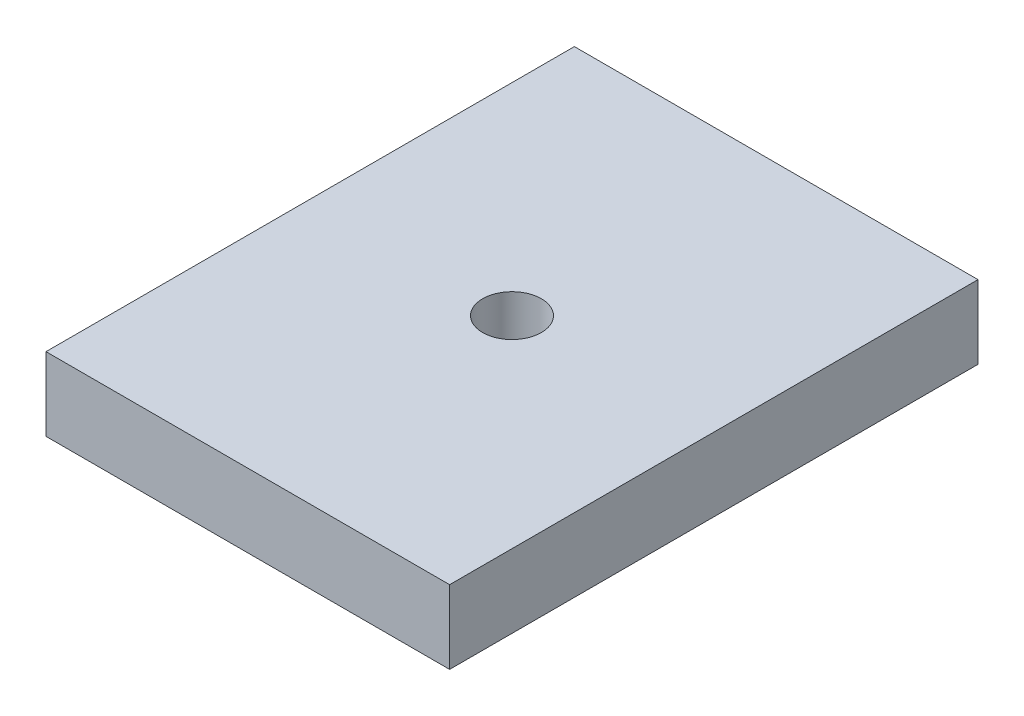
ISO-10303-21;
HEADER;
FILE_DESCRIPTION(('STEP AP214'),'2;1');
FILE_NAME('part.step','',(''),(''),'','','');
FILE_SCHEMA(('AUTOMOTIVE_DESIGN { 1 0 10303 214 1 1 1 1 }'));
ENDSEC;
DATA;
#1=APPLICATION_CONTEXT('core data for automotive mechanical design processes');
#2=APPLICATION_PROTOCOL_DEFINITION('international standard','automotive_design',2000,#1);
#3=PRODUCT_CONTEXT('',#1,'mechanical');
#4=PRODUCT('Part','Part','',(#3));
#5=PRODUCT_RELATED_PRODUCT_CATEGORY('part','',(#4));
#6=PRODUCT_DEFINITION_FORMATION('','',#4);
#7=PRODUCT_DEFINITION_CONTEXT('part definition',#1,'design');
#8=PRODUCT_DEFINITION('design','',#6,#7);
#9=PRODUCT_DEFINITION_SHAPE('','',#8);
#10=(LENGTH_UNIT() NAMED_UNIT(*) SI_UNIT(.MILLI.,.METRE.));
#11=(NAMED_UNIT(*) PLANE_ANGLE_UNIT() SI_UNIT($,.RADIAN.));
#12=(NAMED_UNIT(*) SI_UNIT($,.STERADIAN.) SOLID_ANGLE_UNIT());
#13=UNCERTAINTY_MEASURE_WITH_UNIT(LENGTH_MEASURE(1.E-05),#10,'distance_accuracy_value','');
#14=(GEOMETRIC_REPRESENTATION_CONTEXT(3) GLOBAL_UNCERTAINTY_ASSIGNED_CONTEXT((#13)) GLOBAL_UNIT_ASSIGNED_CONTEXT((#10,
#11,#12)) REPRESENTATION_CONTEXT('',''));
#15=CARTESIAN_POINT('',(0.,0.,0.));
#16=DIRECTION('',(0.,0.,1.));
#17=DIRECTION('',(1.,0.,0.));
#18=AXIS2_PLACEMENT_3D('',#15,#16,#17);
#19=CARTESIAN_POINT('',(0.,10.,0.));
#20=DIRECTION('',(0.,-1.,0.));
#21=DIRECTION('',(0.,0.,-1.));
#22=AXIS2_PLACEMENT_3D('',#19,#20,#21);
#23=PLANE('',#22);
#24=DIRECTION('',(-1.,0.,0.));
#25=VECTOR('',#24,1.);
#26=CARTESIAN_POINT('',(27.5,10.,-36.));
#27=LINE('',#26,#25);
#28=CARTESIAN_POINT('',(27.5,10.,-36.));
#29=VERTEX_POINT('',#28);
#30=CARTESIAN_POINT('',(-27.5000772685044,10.,-36.));
#31=VERTEX_POINT('',#30);
#32=EDGE_CURVE('E92',#29,#31,#27,.T.);
#33=ORIENTED_EDGE('',*,*,#32,.T.);
#34=DIRECTION('',(0.,0.,1.));
#35=VECTOR('',#34,1.);
#36=CARTESIAN_POINT('',(-27.5000772685044,10.,36.0005700892503));
#37=LINE('',#36,#35);
#38=CARTESIAN_POINT('',(-27.5000772685044,10.,36.0005700892503));
#39=VERTEX_POINT('',#38);
#40=EDGE_CURVE('E87',#31,#39,#37,.T.);
#41=ORIENTED_EDGE('',*,*,#40,.T.);
#42=DIRECTION('',(1.,0.,0.));
#43=VECTOR('',#42,1.);
#44=CARTESIAN_POINT('',(-27.5000772685044,10.,36.0005700892503));
#45=LINE('',#44,#43);
#46=CARTESIAN_POINT('',(27.5,10.,36.0005700892503));
#47=VERTEX_POINT('',#46);
#48=EDGE_CURVE('E90',#39,#47,#45,.T.);
#49=ORIENTED_EDGE('',*,*,#48,.T.);
#50=DIRECTION('',(0.,0.,-1.));
#51=VECTOR('',#50,1.);
#52=CARTESIAN_POINT('',(27.5,10.,-36.));
#53=LINE('',#52,#51);
#54=EDGE_CURVE('E57',#47,#29,#53,.T.);
#55=ORIENTED_EDGE('',*,*,#54,.T.);
#56=EDGE_LOOP('',(#33,#41,#49,#55));
#57=FACE_BOUND('',#56,.T.);
#58=CARTESIAN_POINT('',(0.,10.,0.));
#59=DIRECTION('',(0.,1.,0.));
#60=DIRECTION('',(0.,0.,1.));
#61=AXIS2_PLACEMENT_3D('',#58,#59,#60);
#62=CIRCLE('',#61,4.00000000000005);
#63=CARTESIAN_POINT('',(0.,10.,4.00000000000005));
#64=VERTEX_POINT('',#63);
#65=EDGE_CURVE('E107',#64,#64,#62,.T.);
#66=ORIENTED_EDGE('',*,*,#65,.F.);
#67=EDGE_LOOP('',(#66));
#68=FACE_BOUND('',#67,.T.);
#69=ADVANCED_FACE('F40',(#57,#68),#23,.F.);
#70=CARTESIAN_POINT('',(0.,0.,0.));
#71=DIRECTION('',(0.,-1.,0.));
#72=DIRECTION('',(0.,0.,-1.));
#73=AXIS2_PLACEMENT_3D('',#70,#71,#72);
#74=PLANE('',#73);
#75=DIRECTION('',(-1.,0.,0.));
#76=VECTOR('',#75,1.);
#77=CARTESIAN_POINT('',(27.5,0.,-36.));
#78=LINE('',#77,#76);
#79=CARTESIAN_POINT('',(27.5,0.,-36.));
#80=VERTEX_POINT('',#79);
#81=CARTESIAN_POINT('',(-27.5000772685044,0.,-36.));
#82=VERTEX_POINT('',#81);
#83=EDGE_CURVE('E104',#80,#82,#78,.T.);
#84=ORIENTED_EDGE('',*,*,#83,.F.);
#85=DIRECTION('',(0.,0.,-1.));
#86=VECTOR('',#85,1.);
#87=CARTESIAN_POINT('',(27.5,0.,-36.));
#88=LINE('',#87,#86);
#89=CARTESIAN_POINT('',(27.5,0.,36.0005700892503));
#90=VERTEX_POINT('',#89);
#91=EDGE_CURVE('E80',#90,#80,#88,.T.);
#92=ORIENTED_EDGE('',*,*,#91,.F.);
#93=DIRECTION('',(1.,0.,0.));
#94=VECTOR('',#93,1.);
#95=CARTESIAN_POINT('',(-27.5000772685044,0.,36.0005700892503));
#96=LINE('',#95,#94);
#97=CARTESIAN_POINT('',(-27.5000772685044,0.,36.0005700892503));
#98=VERTEX_POINT('',#97);
#99=EDGE_CURVE('E74',#98,#90,#96,.T.);
#100=ORIENTED_EDGE('',*,*,#99,.F.);
#101=DIRECTION('',(0.,0.,1.));
#102=VECTOR('',#101,1.);
#103=CARTESIAN_POINT('',(-27.5000772685044,0.,36.0005700892503));
#104=LINE('',#103,#102);
#105=EDGE_CURVE('E96',#82,#98,#104,.T.);
#106=ORIENTED_EDGE('',*,*,#105,.F.);
#107=EDGE_LOOP('',(#84,#92,#100,#106));
#108=FACE_BOUND('',#107,.T.);
#109=CARTESIAN_POINT('',(0.,0.,0.));
#110=DIRECTION('',(0.,1.,0.));
#111=DIRECTION('',(0.,0.,1.));
#112=AXIS2_PLACEMENT_3D('',#109,#110,#111);
#113=CIRCLE('',#112,4.00000000000005);
#114=CARTESIAN_POINT('',(0.,0.,4.00000000000005));
#115=VERTEX_POINT('',#114);
#116=EDGE_CURVE('E119',#115,#115,#113,.T.);
#117=ORIENTED_EDGE('',*,*,#116,.T.);
#118=EDGE_LOOP('',(#117));
#119=FACE_BOUND('',#118,.T.);
#120=ADVANCED_FACE('F115',(#108,#119),#74,.T.);
#121=CARTESIAN_POINT('',(27.5,10.,-36.));
#122=DIRECTION('',(0.,0.,1.));
#123=DIRECTION('',(1.,0.,0.));
#124=AXIS2_PLACEMENT_3D('',#121,#122,#123);
#125=PLANE('',#124);
#126=ORIENTED_EDGE('',*,*,#83,.T.);
#127=DIRECTION('',(0.,-1.,0.));
#128=VECTOR('',#127,1.);
#129=CARTESIAN_POINT('',(-27.5000772685044,10.,-36.));
#130=LINE('',#129,#128);
#131=EDGE_CURVE('E11',#31,#82,#130,.T.);
#132=ORIENTED_EDGE('',*,*,#131,.F.);
#133=ORIENTED_EDGE('',*,*,#32,.F.);
#134=DIRECTION('',(0.,-1.,0.));
#135=VECTOR('',#134,1.);
#136=CARTESIAN_POINT('',(27.5,10.,-36.));
#137=LINE('',#136,#135);
#138=EDGE_CURVE('E100',#29,#80,#137,.T.);
#139=ORIENTED_EDGE('',*,*,#138,.T.);
#140=EDGE_LOOP('',(#126,#132,#133,#139));
#141=FACE_BOUND('',#140,.T.);
#142=ADVANCED_FACE('F42',(#141),#125,.F.);
#143=CARTESIAN_POINT('',(-27.5000772685044,10.,36.0005700892503));
#144=DIRECTION('',(1.,0.,0.));
#145=DIRECTION('',(0.,0.,-1.));
#146=AXIS2_PLACEMENT_3D('',#143,#144,#145);
#147=PLANE('',#146);
#148=ORIENTED_EDGE('',*,*,#105,.T.);
#149=DIRECTION('',(0.,-1.,0.));
#150=VECTOR('',#149,1.);
#151=CARTESIAN_POINT('',(-27.5000772685044,10.,36.0005700892503));
#152=LINE('',#151,#150);
#153=EDGE_CURVE('E49',#39,#98,#152,.T.);
#154=ORIENTED_EDGE('',*,*,#153,.F.);
#155=ORIENTED_EDGE('',*,*,#40,.F.);
#156=ORIENTED_EDGE('',*,*,#131,.T.);
#157=EDGE_LOOP('',(#148,#154,#155,#156));
#158=FACE_BOUND('',#157,.T.);
#159=ADVANCED_FACE('F95',(#158),#147,.F.);
#160=CARTESIAN_POINT('',(-27.5000772685044,10.,36.0005700892503));
#161=DIRECTION('',(0.,0.,-1.));
#162=DIRECTION('',(-1.,0.,0.));
#163=AXIS2_PLACEMENT_3D('',#160,#161,#162);
#164=PLANE('',#163);
#165=ORIENTED_EDGE('',*,*,#99,.T.);
#166=DIRECTION('',(0.,-1.,0.));
#167=VECTOR('',#166,1.);
#168=CARTESIAN_POINT('',(27.5,10.,36.0005700892503));
#169=LINE('',#168,#167);
#170=EDGE_CURVE('E97',#47,#90,#169,.T.);
#171=ORIENTED_EDGE('',*,*,#170,.F.);
#172=ORIENTED_EDGE('',*,*,#48,.F.);
#173=ORIENTED_EDGE('',*,*,#153,.T.);
#174=EDGE_LOOP('',(#165,#171,#172,#173));
#175=FACE_BOUND('',#174,.T.);
#176=ADVANCED_FACE('F98',(#175),#164,.F.);
#177=CARTESIAN_POINT('',(27.5,10.,-36.));
#178=DIRECTION('',(-1.,0.,0.));
#179=DIRECTION('',(0.,0.,1.));
#180=AXIS2_PLACEMENT_3D('',#177,#178,#179);
#181=PLANE('',#180);
#182=ORIENTED_EDGE('',*,*,#91,.T.);
#183=ORIENTED_EDGE('',*,*,#138,.F.);
#184=ORIENTED_EDGE('',*,*,#54,.F.);
#185=ORIENTED_EDGE('',*,*,#170,.T.);
#186=EDGE_LOOP('',(#182,#183,#184,#185));
#187=FACE_BOUND('',#186,.T.);
#188=ADVANCED_FACE('F112',(#187),#181,.F.);
#189=CARTESIAN_POINT('',(0.,10.,0.));
#190=DIRECTION('',(0.,-1.,0.));
#191=DIRECTION('',(0.,0.,-1.));
#192=AXIS2_PLACEMENT_3D('',#189,#190,#191);
#193=CYLINDRICAL_SURFACE('',#192,4.00000000000005);
#194=ORIENTED_EDGE('',*,*,#65,.T.);
#195=EDGE_LOOP('',(#194));
#196=FACE_BOUND('',#195,.T.);
#197=ORIENTED_EDGE('',*,*,#116,.F.);
#198=EDGE_LOOP('',(#197));
#199=FACE_BOUND('',#198,.T.);
#200=ADVANCED_FACE('F125',(#196,#199),#193,.F.);
#201=CLOSED_SHELL('',(#69,#120,#142,#159,#176,#188,#200));
#202=MANIFOLD_SOLID_BREP('B2',#201);
#203=ADVANCED_BREP_SHAPE_REPRESENTATION('',(#18,#202),#14);
#204=SHAPE_DEFINITION_REPRESENTATION(#9,#203);
ENDSEC;
END-ISO-10303-21;
